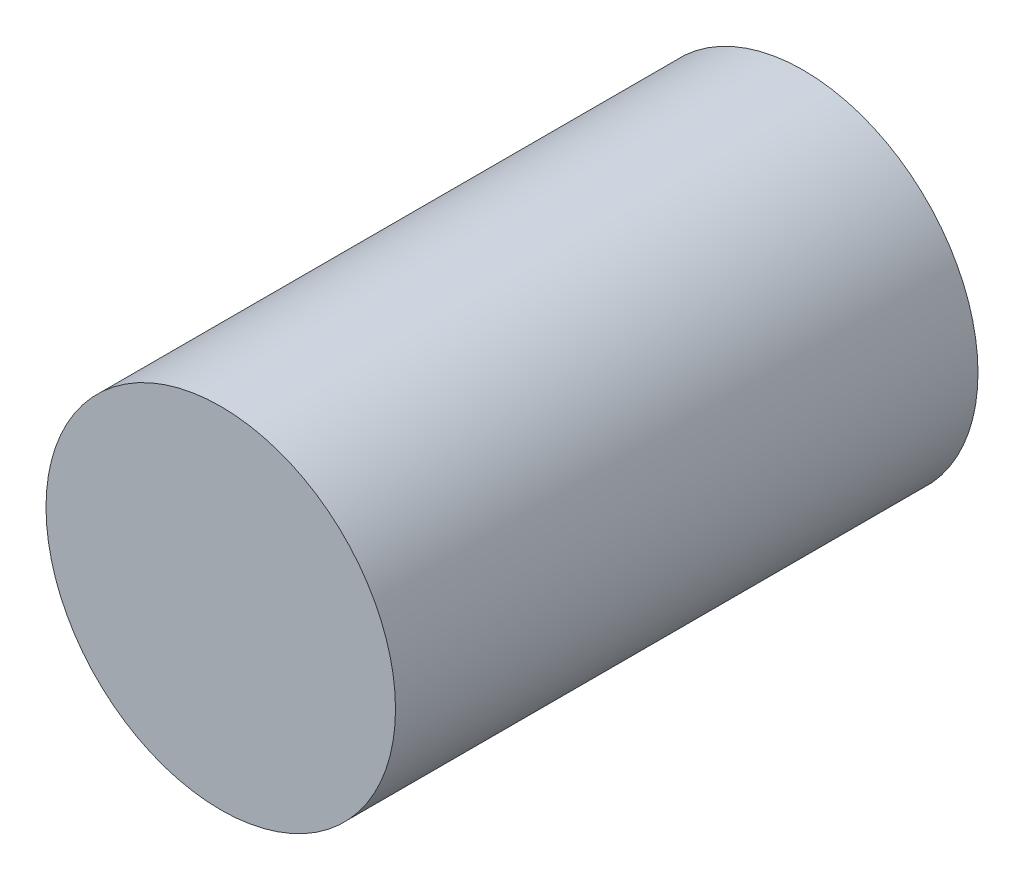
ISO-10303-21;
HEADER;
FILE_DESCRIPTION(('STEP AP214'),'2;1');
FILE_NAME('part.step','',(''),(''),'','','');
FILE_SCHEMA(('AUTOMOTIVE_DESIGN { 1 0 10303 214 1 1 1 1 }'));
ENDSEC;
DATA;
#1=APPLICATION_CONTEXT('core data for automotive mechanical design processes');
#2=APPLICATION_PROTOCOL_DEFINITION('international standard','automotive_design',2000,#1);
#3=PRODUCT_CONTEXT('',#1,'mechanical');
#4=PRODUCT('Part','Part','',(#3));
#5=PRODUCT_RELATED_PRODUCT_CATEGORY('part','',(#4));
#6=PRODUCT_DEFINITION_FORMATION('','',#4);
#7=PRODUCT_DEFINITION_CONTEXT('part definition',#1,'design');
#8=PRODUCT_DEFINITION('design','',#6,#7);
#9=PRODUCT_DEFINITION_SHAPE('','',#8);
#10=(LENGTH_UNIT() NAMED_UNIT(*) SI_UNIT(.MILLI.,.METRE.));
#11=(NAMED_UNIT(*) PLANE_ANGLE_UNIT() SI_UNIT($,.RADIAN.));
#12=(NAMED_UNIT(*) SI_UNIT($,.STERADIAN.) SOLID_ANGLE_UNIT());
#13=UNCERTAINTY_MEASURE_WITH_UNIT(LENGTH_MEASURE(1.E-05),#10,'distance_accuracy_value','');
#14=(GEOMETRIC_REPRESENTATION_CONTEXT(3) GLOBAL_UNCERTAINTY_ASSIGNED_CONTEXT((#13)) GLOBAL_UNIT_ASSIGNED_CONTEXT((#10,
#11,#12)) REPRESENTATION_CONTEXT('',''));
#15=CARTESIAN_POINT('',(0.,0.,0.));
#16=DIRECTION('',(0.,0.,1.));
#17=DIRECTION('',(1.,0.,0.));
#18=AXIS2_PLACEMENT_3D('',#15,#16,#17);
#19=CARTESIAN_POINT('',(0.,0.,500.));
#20=DIRECTION('',(0.,0.,-1.));
#21=DIRECTION('',(-1.,0.,0.));
#22=AXIS2_PLACEMENT_3D('',#19,#20,#21);
#23=CYLINDRICAL_SURFACE('',#22,150.);
#24=CARTESIAN_POINT('',(0.,0.,500.));
#25=DIRECTION('',(0.,0.,1.));
#26=DIRECTION('',(1.,0.,0.));
#27=AXIS2_PLACEMENT_3D('',#24,#25,#26);
#28=CIRCLE('',#27,150.);
#29=CARTESIAN_POINT('',(150.,0.,500.));
#30=VERTEX_POINT('',#29);
#31=EDGE_CURVE('E10',#30,#30,#28,.T.);
#32=ORIENTED_EDGE('',*,*,#31,.F.);
#33=EDGE_LOOP('',(#32));
#34=FACE_BOUND('',#33,.T.);
#35=CARTESIAN_POINT('',(0.,0.,0.));
#36=DIRECTION('',(0.,0.,1.));
#37=DIRECTION('',(1.,0.,0.));
#38=AXIS2_PLACEMENT_3D('',#35,#36,#37);
#39=CIRCLE('',#38,150.);
#40=CARTESIAN_POINT('',(150.,0.,0.));
#41=VERTEX_POINT('',#40);
#42=EDGE_CURVE('E44',#41,#41,#39,.T.);
#43=ORIENTED_EDGE('',*,*,#42,.T.);
#44=EDGE_LOOP('',(#43));
#45=FACE_BOUND('',#44,.T.);
#46=ADVANCED_FACE('F41',(#34,#45),#23,.T.);
#47=CARTESIAN_POINT('',(0.,0.,500.));
#48=DIRECTION('',(0.,0.,1.));
#49=DIRECTION('',(1.,0.,0.));
#50=AXIS2_PLACEMENT_3D('',#47,#48,#49);
#51=PLANE('',#50);
#52=ORIENTED_EDGE('',*,*,#31,.T.);
#53=EDGE_LOOP('',(#52));
#54=FACE_BOUND('',#53,.T.);
#55=ADVANCED_FACE('F58',(#54),#51,.T.);
#56=CARTESIAN_POINT('',(0.,0.,0.));
#57=DIRECTION('',(0.,0.,1.));
#58=DIRECTION('',(1.,0.,0.));
#59=AXIS2_PLACEMENT_3D('',#56,#57,#58);
#60=PLANE('',#59);
#61=ORIENTED_EDGE('',*,*,#42,.F.);
#62=EDGE_LOOP('',(#61));
#63=FACE_BOUND('',#62,.T.);
#64=ADVANCED_FACE('F56',(#63),#60,.F.);
#65=CLOSED_SHELL('',(#46,#55,#64));
#66=MANIFOLD_SOLID_BREP('B2',#65);
#67=ADVANCED_BREP_SHAPE_REPRESENTATION('',(#18,#66),#14);
#68=SHAPE_DEFINITION_REPRESENTATION(#9,#67);
ENDSEC;
END-ISO-10303-21;
